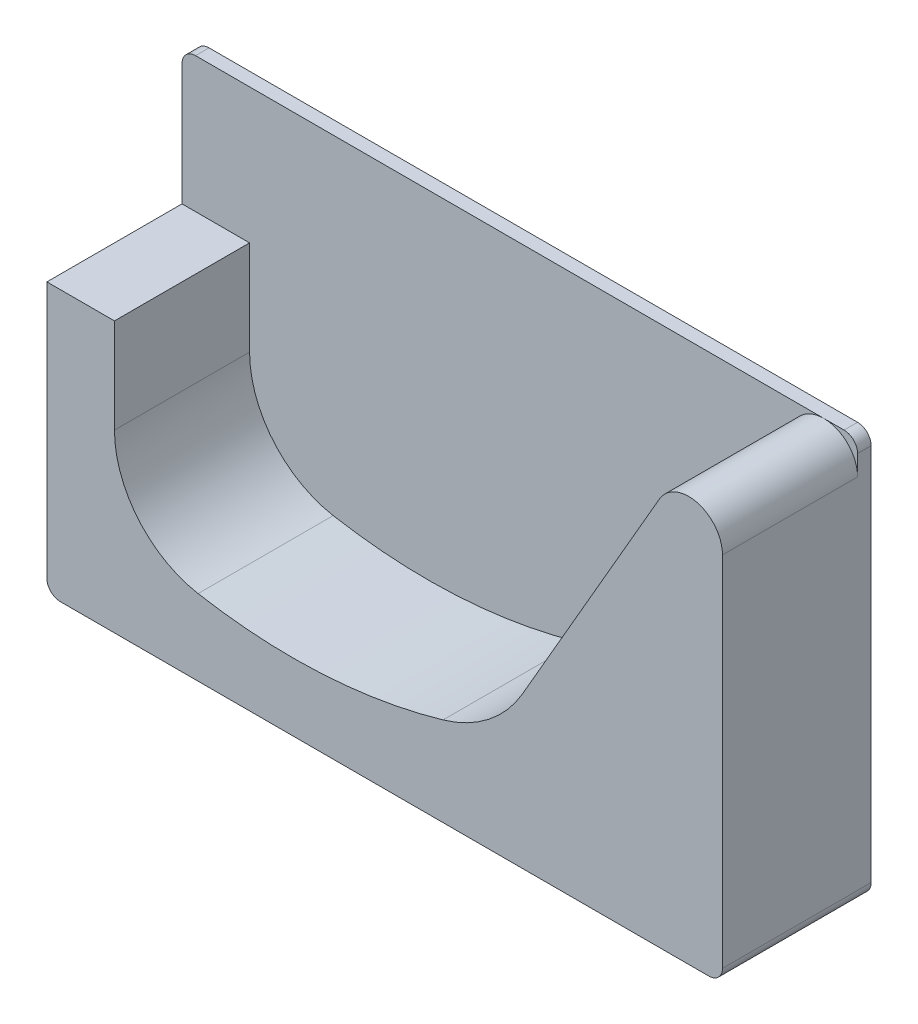
ISO-10303-21;
HEADER;
FILE_DESCRIPTION(('STEP AP214'),'2;1');
FILE_NAME('part.step','',(''),(''),'','','');
FILE_SCHEMA(('AUTOMOTIVE_DESIGN { 1 0 10303 214 1 1 1 1 }'));
ENDSEC;
DATA;
#1=APPLICATION_CONTEXT('core data for automotive mechanical design processes');
#2=APPLICATION_PROTOCOL_DEFINITION('international standard','automotive_design',2000,#1);
#3=PRODUCT_CONTEXT('',#1,'mechanical');
#4=PRODUCT('Part','Part','',(#3));
#5=PRODUCT_RELATED_PRODUCT_CATEGORY('part','',(#4));
#6=PRODUCT_DEFINITION_FORMATION('','',#4);
#7=PRODUCT_DEFINITION_CONTEXT('part definition',#1,'design');
#8=PRODUCT_DEFINITION('design','',#6,#7);
#9=PRODUCT_DEFINITION_SHAPE('','',#8);
#10=(LENGTH_UNIT() NAMED_UNIT(*) SI_UNIT(.MILLI.,.METRE.));
#11=(NAMED_UNIT(*) PLANE_ANGLE_UNIT() SI_UNIT($,.RADIAN.));
#12=(NAMED_UNIT(*) SI_UNIT($,.STERADIAN.) SOLID_ANGLE_UNIT());
#13=UNCERTAINTY_MEASURE_WITH_UNIT(LENGTH_MEASURE(1.E-05),#10,'distance_accuracy_value','');
#14=(GEOMETRIC_REPRESENTATION_CONTEXT(3) GLOBAL_UNCERTAINTY_ASSIGNED_CONTEXT((#13)) GLOBAL_UNIT_ASSIGNED_CONTEXT((#10,
#11,#12)) REPRESENTATION_CONTEXT('',''));
#15=CARTESIAN_POINT('',(0.,0.,0.));
#16=DIRECTION('',(0.,0.,1.));
#17=DIRECTION('',(1.,0.,0.));
#18=AXIS2_PLACEMENT_3D('',#15,#16,#17);
#19=CARTESIAN_POINT('',(0.,0.,2.));
#20=DIRECTION('',(0.,0.,-1.));
#21=DIRECTION('',(-1.,0.,0.));
#22=AXIS2_PLACEMENT_3D('',#19,#20,#21);
#23=PLANE('',#22);
#24=CARTESIAN_POINT('',(95.,55.,2.));
#25=DIRECTION('',(0.,0.,1.));
#26=DIRECTION('',(-1.,0.,0.));
#27=AXIS2_PLACEMENT_3D('',#24,#25,#26);
#28=CIRCLE('',#27,5.);
#29=CARTESIAN_POINT('',(100.,55.,2.));
#30=VERTEX_POINT('',#29);
#31=CARTESIAN_POINT('',(95.,60.,2.));
#32=VERTEX_POINT('',#31);
#33=EDGE_CURVE('E57',#30,#32,#28,.T.);
#34=ORIENTED_EDGE('',*,*,#33,.F.);
#35=DIRECTION('',(0.,1.,0.));
#36=VECTOR('',#35,1.);
#37=CARTESIAN_POINT('',(100.,0.,2.));
#38=LINE('',#37,#36);
#39=CARTESIAN_POINT('',(100.,58.,2.));
#40=VERTEX_POINT('',#39);
#41=EDGE_CURVE('E201',#30,#40,#38,.T.);
#42=ORIENTED_EDGE('',*,*,#41,.T.);
#43=CARTESIAN_POINT('',(98.,58.,2.));
#44=DIRECTION('',(0.,0.,-1.));
#45=DIRECTION('',(-1.,0.,0.));
#46=AXIS2_PLACEMENT_3D('',#43,#44,#45);
#47=CIRCLE('',#46,2.);
#48=CARTESIAN_POINT('',(98.,60.,2.));
#49=VERTEX_POINT('',#48);
#50=EDGE_CURVE('E253',#40,#49,#47,.F.);
#51=ORIENTED_EDGE('',*,*,#50,.T.);
#52=DIRECTION('',(-1.,0.,0.));
#53=VECTOR('',#52,1.);
#54=CARTESIAN_POINT('',(0.,60.,2.));
#55=LINE('',#54,#53);
#56=EDGE_CURVE('E208',#49,#32,#55,.T.);
#57=ORIENTED_EDGE('',*,*,#56,.T.);
#58=EDGE_LOOP('',(#34,#42,#51,#57));
#59=FACE_BOUND('',#58,.T.);
#60=ADVANCED_FACE('F44',(#59),#23,.F.);
#61=CARTESIAN_POINT('',(90.6698729810778,57.5,2.));
#62=VERTEX_POINT('',#61);
#63=EDGE_CURVE('E11',#32,#62,#28,.T.);
#64=ORIENTED_EDGE('',*,*,#63,.F.);
#65=CARTESIAN_POINT('',(2.,60.,2.));
#66=VERTEX_POINT('',#65);
#67=EDGE_CURVE('E210',#32,#66,#55,.T.);
#68=ORIENTED_EDGE('',*,*,#67,.T.);
#69=CARTESIAN_POINT('',(2.,58.,2.));
#70=DIRECTION('',(0.,0.,-1.));
#71=DIRECTION('',(-1.,0.,0.));
#72=AXIS2_PLACEMENT_3D('',#69,#70,#71);
#73=CIRCLE('',#72,2.);
#74=CARTESIAN_POINT('',(0.,58.,2.));
#75=VERTEX_POINT('',#74);
#76=EDGE_CURVE('E248',#66,#75,#73,.F.);
#77=ORIENTED_EDGE('',*,*,#76,.T.);
#78=DIRECTION('',(0.,-1.,0.));
#79=VECTOR('',#78,1.);
#80=CARTESIAN_POINT('',(0.,0.,2.));
#81=LINE('',#80,#79);
#82=CARTESIAN_POINT('',(0.,40.,2.));
#83=VERTEX_POINT('',#82);
#84=EDGE_CURVE('E199',#75,#83,#81,.T.);
#85=ORIENTED_EDGE('',*,*,#84,.T.);
#86=DIRECTION('',(-1.,0.,0.));
#87=VECTOR('',#86,1.);
#88=CARTESIAN_POINT('',(0.,40.,2.));
#89=LINE('',#88,#87);
#90=CARTESIAN_POINT('',(10.,40.,2.));
#91=VERTEX_POINT('',#90);
#92=EDGE_CURVE('E295',#91,#83,#89,.T.);
#93=ORIENTED_EDGE('',*,*,#92,.F.);
#94=DIRECTION('',(0.,1.,0.));
#95=VECTOR('',#94,1.);
#96=CARTESIAN_POINT('',(10.,40.,2.));
#97=LINE('',#96,#95);
#98=CARTESIAN_POINT('',(10.,26.,2.));
#99=VERTEX_POINT('',#98);
#100=EDGE_CURVE('E299',#99,#91,#97,.T.);
#101=ORIENTED_EDGE('',*,*,#100,.F.);
#102=CARTESIAN_POINT('',(25.,26.,2.));
#103=DIRECTION('',(0.,0.,-1.));
#104=DIRECTION('',(1.,0.,0.));
#105=AXIS2_PLACEMENT_3D('',#102,#103,#104);
#106=CIRCLE('',#105,15.);
#107=CARTESIAN_POINT('',(22.3789653788614,11.2307692307692,2.));
#108=VERTEX_POINT('',#107);
#109=EDGE_CURVE('E186',#108,#99,#106,.T.);
#110=ORIENTED_EDGE('',*,*,#109,.F.);
#111=CARTESIAN_POINT('',(36.3578166916006,90.,2.));
#112=DIRECTION('',(0.,0.,-1.));
#113=DIRECTION('',(1.,0.,0.));
#114=AXIS2_PLACEMENT_3D('',#111,#112,#113);
#115=CIRCLE('',#114,80.);
#116=CARTESIAN_POINT('',(58.6401265520551,13.1657715124132,2.));
#117=VERTEX_POINT('',#116);
#118=EDGE_CURVE('E184',#117,#108,#115,.T.);
#119=ORIENTED_EDGE('',*,*,#118,.F.);
#120=CARTESIAN_POINT('',(53.0695490869415,32.3743286343099,2.));
#121=DIRECTION('',(0.,0.,-1.));
#122=DIRECTION('',(1.,0.,0.));
#123=AXIS2_PLACEMENT_3D('',#120,#121,#122);
#124=CIRCLE('',#123,20.);
#125=CARTESIAN_POINT('',(70.3900571626302,22.3743286343099,2.));
#126=VERTEX_POINT('',#125);
#127=EDGE_CURVE('E70',#126,#117,#124,.T.);
#128=ORIENTED_EDGE('',*,*,#127,.F.);
#129=DIRECTION('',(-0.500000000000001,-0.866025403784438,0.));
#130=VECTOR('',#129,1.);
#131=CARTESIAN_POINT('',(70.3900571626302,22.3743286343099,2.));
#132=LINE('',#131,#130);
#133=EDGE_CURVE('E65',#62,#126,#132,.T.);
#134=ORIENTED_EDGE('',*,*,#133,.F.);
#135=EDGE_LOOP('',(#64,#68,#77,#85,#93,#101,#110,#119,#128,#134));
#136=FACE_BOUND('',#135,.T.);
#137=ADVANCED_FACE('F292',(#136),#23,.F.);
#138=CARTESIAN_POINT('',(0.,0.,2.));
#139=DIRECTION('',(1.,0.,0.));
#140=DIRECTION('',(0.,0.,-1.));
#141=AXIS2_PLACEMENT_3D('',#138,#139,#140);
#142=PLANE('',#141);
#143=DIRECTION('',(0.,-1.,0.));
#144=VECTOR('',#143,1.);
#145=CARTESIAN_POINT('',(0.,0.,0.));
#146=LINE('',#145,#144);
#147=CARTESIAN_POINT('',(0.,58.,0.));
#148=VERTEX_POINT('',#147);
#149=CARTESIAN_POINT('',(0.,2.,0.));
#150=VERTEX_POINT('',#149);
#151=EDGE_CURVE('E188',#148,#150,#146,.T.);
#152=ORIENTED_EDGE('',*,*,#151,.T.);
#153=DIRECTION('',(0.,0.,-1.));
#154=VECTOR('',#153,1.);
#155=CARTESIAN_POINT('',(0.,2.,2.));
#156=LINE('',#155,#154);
#157=CARTESIAN_POINT('',(0.,1.99999999999999,22.));
#158=VERTEX_POINT('',#157);
#159=EDGE_CURVE('E242',#150,#158,#156,.F.);
#160=ORIENTED_EDGE('',*,*,#159,.T.);
#161=DIRECTION('',(0.,-1.,0.));
#162=VECTOR('',#161,1.);
#163=CARTESIAN_POINT('',(0.,1.99999999999999,22.));
#164=LINE('',#163,#162);
#165=CARTESIAN_POINT('',(0.,40.,22.));
#166=VERTEX_POINT('',#165);
#167=EDGE_CURVE('E357',#166,#158,#164,.T.);
#168=ORIENTED_EDGE('',*,*,#167,.F.);
#169=DIRECTION('',(0.,0.,-1.));
#170=VECTOR('',#169,1.);
#171=CARTESIAN_POINT('',(0.,40.,22.));
#172=LINE('',#171,#170);
#173=EDGE_CURVE('E198',#166,#83,#172,.T.);
#174=ORIENTED_EDGE('',*,*,#173,.T.);
#175=ORIENTED_EDGE('',*,*,#84,.F.);
#176=DIRECTION('',(0.,0.,-1.));
#177=VECTOR('',#176,1.);
#178=CARTESIAN_POINT('',(0.,58.,2.));
#179=LINE('',#178,#177);
#180=EDGE_CURVE('E244',#75,#148,#179,.T.);
#181=ORIENTED_EDGE('',*,*,#180,.T.);
#182=EDGE_LOOP('',(#152,#160,#168,#174,#175,#181));
#183=FACE_BOUND('',#182,.T.);
#184=ADVANCED_FACE('F282',(#183),#142,.F.);
#185=CARTESIAN_POINT('',(0.,0.,2.));
#186=DIRECTION('',(0.,1.,0.));
#187=DIRECTION('',(0.,0.,1.));
#188=AXIS2_PLACEMENT_3D('',#185,#186,#187);
#189=PLANE('',#188);
#190=DIRECTION('',(0.,0.,-1.));
#191=VECTOR('',#190,1.);
#192=CARTESIAN_POINT('',(98.,0.,2.));
#193=LINE('',#192,#191);
#194=CARTESIAN_POINT('',(98.,0.,0.));
#195=VERTEX_POINT('',#194);
#196=CARTESIAN_POINT('',(98.,0.,22.));
#197=VERTEX_POINT('',#196);
#198=EDGE_CURVE('E211',#195,#197,#193,.F.);
#199=ORIENTED_EDGE('',*,*,#198,.T.);
#200=DIRECTION('',(1.,0.,0.));
#201=VECTOR('',#200,1.);
#202=CARTESIAN_POINT('',(98.,0.,22.));
#203=LINE('',#202,#201);
#204=CARTESIAN_POINT('',(2.,0.,22.));
#205=VERTEX_POINT('',#204);
#206=EDGE_CURVE('E346',#205,#197,#203,.T.);
#207=ORIENTED_EDGE('',*,*,#206,.F.);
#208=DIRECTION('',(0.,0.,-1.));
#209=VECTOR('',#208,1.);
#210=CARTESIAN_POINT('',(2.,0.,2.));
#211=LINE('',#210,#209);
#212=CARTESIAN_POINT('',(2.,0.,0.));
#213=VERTEX_POINT('',#212);
#214=EDGE_CURVE('E223',#205,#213,#211,.T.);
#215=ORIENTED_EDGE('',*,*,#214,.T.);
#216=DIRECTION('',(1.,0.,0.));
#217=VECTOR('',#216,1.);
#218=CARTESIAN_POINT('',(0.,0.,0.));
#219=LINE('',#218,#217);
#220=EDGE_CURVE('E194',#213,#195,#219,.T.);
#221=ORIENTED_EDGE('',*,*,#220,.T.);
#222=EDGE_LOOP('',(#199,#207,#215,#221));
#223=FACE_BOUND('',#222,.T.);
#224=ADVANCED_FACE('F366',(#223),#189,.F.);
#225=CARTESIAN_POINT('',(100.,0.,2.));
#226=DIRECTION('',(-1.,0.,0.));
#227=DIRECTION('',(0.,0.,1.));
#228=AXIS2_PLACEMENT_3D('',#225,#226,#227);
#229=PLANE('',#228);
#230=ORIENTED_EDGE('',*,*,#41,.F.);
#231=DIRECTION('',(0.,0.,-1.));
#232=VECTOR('',#231,1.);
#233=CARTESIAN_POINT('',(100.,55.,22.));
#234=LINE('',#233,#232);
#235=CARTESIAN_POINT('',(100.,55.,22.));
#236=VERTEX_POINT('',#235);
#237=EDGE_CURVE('E326',#236,#30,#234,.T.);
#238=ORIENTED_EDGE('',*,*,#237,.F.);
#239=DIRECTION('',(0.,1.,0.));
#240=VECTOR('',#239,1.);
#241=CARTESIAN_POINT('',(100.,55.,22.));
#242=LINE('',#241,#240);
#243=CARTESIAN_POINT('',(100.,2.,22.));
#244=VERTEX_POINT('',#243);
#245=EDGE_CURVE('E342',#244,#236,#242,.T.);
#246=ORIENTED_EDGE('',*,*,#245,.F.);
#247=DIRECTION('',(0.,0.,-1.));
#248=VECTOR('',#247,1.);
#249=CARTESIAN_POINT('',(100.,2.,2.));
#250=LINE('',#249,#248);
#251=CARTESIAN_POINT('',(100.,2.,0.));
#252=VERTEX_POINT('',#251);
#253=EDGE_CURVE('E256',#244,#252,#250,.T.);
#254=ORIENTED_EDGE('',*,*,#253,.T.);
#255=DIRECTION('',(0.,1.,0.));
#256=VECTOR('',#255,1.);
#257=CARTESIAN_POINT('',(100.,0.,0.));
#258=LINE('',#257,#256);
#259=CARTESIAN_POINT('',(100.,58.,0.));
#260=VERTEX_POINT('',#259);
#261=EDGE_CURVE('E216',#252,#260,#258,.T.);
#262=ORIENTED_EDGE('',*,*,#261,.T.);
#263=DIRECTION('',(0.,0.,-1.));
#264=VECTOR('',#263,1.);
#265=CARTESIAN_POINT('',(100.,58.,2.));
#266=LINE('',#265,#264);
#267=EDGE_CURVE('E255',#260,#40,#266,.F.);
#268=ORIENTED_EDGE('',*,*,#267,.T.);
#269=EDGE_LOOP('',(#230,#238,#246,#254,#262,#268));
#270=FACE_BOUND('',#269,.T.);
#271=ADVANCED_FACE('F376',(#270),#229,.F.);
#272=CARTESIAN_POINT('',(0.,60.,2.));
#273=DIRECTION('',(0.,-1.,0.));
#274=DIRECTION('',(0.,0.,-1.));
#275=AXIS2_PLACEMENT_3D('',#272,#273,#274);
#276=PLANE('',#275);
#277=ORIENTED_EDGE('',*,*,#56,.F.);
#278=DIRECTION('',(0.,0.,-1.));
#279=VECTOR('',#278,1.);
#280=CARTESIAN_POINT('',(98.,60.,2.));
#281=LINE('',#280,#279);
#282=CARTESIAN_POINT('',(98.,60.,0.));
#283=VERTEX_POINT('',#282);
#284=EDGE_CURVE('E47',#49,#283,#281,.T.);
#285=ORIENTED_EDGE('',*,*,#284,.T.);
#286=DIRECTION('',(-1.,0.,0.));
#287=VECTOR('',#286,1.);
#288=CARTESIAN_POINT('',(0.,60.,0.));
#289=LINE('',#288,#287);
#290=CARTESIAN_POINT('',(2.,60.,0.));
#291=VERTEX_POINT('',#290);
#292=EDGE_CURVE('E204',#283,#291,#289,.T.);
#293=ORIENTED_EDGE('',*,*,#292,.T.);
#294=DIRECTION('',(0.,0.,-1.));
#295=VECTOR('',#294,1.);
#296=CARTESIAN_POINT('',(2.,60.,2.));
#297=LINE('',#296,#295);
#298=EDGE_CURVE('E261',#291,#66,#297,.F.);
#299=ORIENTED_EDGE('',*,*,#298,.T.);
#300=ORIENTED_EDGE('',*,*,#67,.F.);
#301=EDGE_LOOP('',(#277,#285,#293,#299,#300));
#302=FACE_BOUND('',#301,.T.);
#303=ADVANCED_FACE('F272',(#302),#276,.F.);
#304=CARTESIAN_POINT('',(0.,0.,0.));
#305=DIRECTION('',(0.,0.,-1.));
#306=DIRECTION('',(-1.,0.,0.));
#307=AXIS2_PLACEMENT_3D('',#304,#305,#306);
#308=PLANE('',#307);
#309=ORIENTED_EDGE('',*,*,#220,.F.);
#310=CARTESIAN_POINT('',(2.,2.,0.));
#311=DIRECTION('',(0.,0.,-1.));
#312=DIRECTION('',(-1.,0.,0.));
#313=AXIS2_PLACEMENT_3D('',#310,#311,#312);
#314=CIRCLE('',#313,2.);
#315=EDGE_CURVE('E236',#213,#150,#314,.T.);
#316=ORIENTED_EDGE('',*,*,#315,.T.);
#317=ORIENTED_EDGE('',*,*,#151,.F.);
#318=CARTESIAN_POINT('',(2.,58.,0.));
#319=DIRECTION('',(0.,0.,-1.));
#320=DIRECTION('',(-1.,0.,0.));
#321=AXIS2_PLACEMENT_3D('',#318,#319,#320);
#322=CIRCLE('',#321,2.);
#323=EDGE_CURVE('E228',#148,#291,#322,.T.);
#324=ORIENTED_EDGE('',*,*,#323,.T.);
#325=ORIENTED_EDGE('',*,*,#292,.F.);
#326=CARTESIAN_POINT('',(98.,58.,0.));
#327=DIRECTION('',(0.,0.,-1.));
#328=DIRECTION('',(-1.,0.,0.));
#329=AXIS2_PLACEMENT_3D('',#326,#327,#328);
#330=CIRCLE('',#329,2.);
#331=EDGE_CURVE('E235',#283,#260,#330,.T.);
#332=ORIENTED_EDGE('',*,*,#331,.T.);
#333=ORIENTED_EDGE('',*,*,#261,.F.);
#334=CARTESIAN_POINT('',(98.,2.,0.));
#335=DIRECTION('',(0.,0.,-1.));
#336=DIRECTION('',(-1.,0.,0.));
#337=AXIS2_PLACEMENT_3D('',#334,#335,#336);
#338=CIRCLE('',#337,2.);
#339=EDGE_CURVE('E231',#252,#195,#338,.T.);
#340=ORIENTED_EDGE('',*,*,#339,.T.);
#341=EDGE_LOOP('',(#309,#316,#317,#324,#325,#332,#333,#340));
#342=FACE_BOUND('',#341,.T.);
#343=ADVANCED_FACE('F279',(#342),#308,.T.);
#344=CARTESIAN_POINT('',(2.,2.,2.));
#345=DIRECTION('',(0.,0.,-1.));
#346=DIRECTION('',(-1.,0.,0.));
#347=AXIS2_PLACEMENT_3D('',#344,#345,#346);
#348=CYLINDRICAL_SURFACE('',#347,2.);
#349=ORIENTED_EDGE('',*,*,#214,.F.);
#350=CARTESIAN_POINT('',(2.,2.,22.));
#351=DIRECTION('',(0.,0.,1.));
#352=DIRECTION('',(-1.,0.,0.));
#353=AXIS2_PLACEMENT_3D('',#350,#351,#352);
#354=CIRCLE('',#353,2.);
#355=EDGE_CURVE('E351',#158,#205,#354,.T.);
#356=ORIENTED_EDGE('',*,*,#355,.F.);
#357=ORIENTED_EDGE('',*,*,#159,.F.);
#358=ORIENTED_EDGE('',*,*,#315,.F.);
#359=EDGE_LOOP('',(#349,#356,#357,#358));
#360=FACE_BOUND('',#359,.T.);
#361=ADVANCED_FACE('F368',(#360),#348,.T.);
#362=CARTESIAN_POINT('',(98.,2.,2.));
#363=DIRECTION('',(0.,0.,-1.));
#364=DIRECTION('',(-1.,0.,0.));
#365=AXIS2_PLACEMENT_3D('',#362,#363,#364);
#366=CYLINDRICAL_SURFACE('',#365,2.);
#367=ORIENTED_EDGE('',*,*,#253,.F.);
#368=CARTESIAN_POINT('',(98.,2.,22.));
#369=DIRECTION('',(0.,0.,1.));
#370=DIRECTION('',(-1.,0.,0.));
#371=AXIS2_PLACEMENT_3D('',#368,#369,#370);
#372=CIRCLE('',#371,2.);
#373=EDGE_CURVE('E344',#197,#244,#372,.T.);
#374=ORIENTED_EDGE('',*,*,#373,.F.);
#375=ORIENTED_EDGE('',*,*,#198,.F.);
#376=ORIENTED_EDGE('',*,*,#339,.F.);
#377=EDGE_LOOP('',(#367,#374,#375,#376));
#378=FACE_BOUND('',#377,.T.);
#379=ADVANCED_FACE('F371',(#378),#366,.T.);
#380=CARTESIAN_POINT('',(98.,58.,2.));
#381=DIRECTION('',(0.,0.,-1.));
#382=DIRECTION('',(-1.,0.,0.));
#383=AXIS2_PLACEMENT_3D('',#380,#381,#382);
#384=CYLINDRICAL_SURFACE('',#383,2.);
#385=ORIENTED_EDGE('',*,*,#50,.F.);
#386=ORIENTED_EDGE('',*,*,#267,.F.);
#387=ORIENTED_EDGE('',*,*,#331,.F.);
#388=ORIENTED_EDGE('',*,*,#284,.F.);
#389=EDGE_LOOP('',(#385,#386,#387,#388));
#390=FACE_BOUND('',#389,.T.);
#391=ADVANCED_FACE('F424',(#390),#384,.T.);
#392=CARTESIAN_POINT('',(2.,58.,2.));
#393=DIRECTION('',(0.,0.,-1.));
#394=DIRECTION('',(-1.,0.,0.));
#395=AXIS2_PLACEMENT_3D('',#392,#393,#394);
#396=CYLINDRICAL_SURFACE('',#395,2.);
#397=ORIENTED_EDGE('',*,*,#76,.F.);
#398=ORIENTED_EDGE('',*,*,#298,.F.);
#399=ORIENTED_EDGE('',*,*,#323,.F.);
#400=ORIENTED_EDGE('',*,*,#180,.F.);
#401=EDGE_LOOP('',(#397,#398,#399,#400));
#402=FACE_BOUND('',#401,.T.);
#403=ADVANCED_FACE('F50',(#402),#396,.T.);
#404=CARTESIAN_POINT('',(25.,26.,22.));
#405=DIRECTION('',(0.,0.,-1.));
#406=DIRECTION('',(-1.,0.,0.));
#407=AXIS2_PLACEMENT_3D('',#404,#405,#406);
#408=CYLINDRICAL_SURFACE('',#407,15.);
#409=ORIENTED_EDGE('',*,*,#109,.T.);
#410=DIRECTION('',(0.,0.,-1.));
#411=VECTOR('',#410,1.);
#412=CARTESIAN_POINT('',(10.,26.,22.));
#413=LINE('',#412,#411);
#414=CARTESIAN_POINT('',(10.,26.,22.));
#415=VERTEX_POINT('',#414);
#416=EDGE_CURVE('E167',#415,#99,#413,.T.);
#417=ORIENTED_EDGE('',*,*,#416,.F.);
#418=CARTESIAN_POINT('',(25.,26.,22.));
#419=DIRECTION('',(0.,0.,-1.));
#420=DIRECTION('',(1.,0.,0.));
#421=AXIS2_PLACEMENT_3D('',#418,#419,#420);
#422=CIRCLE('',#421,15.);
#423=CARTESIAN_POINT('',(22.3789653788614,11.2307692307692,22.));
#424=VERTEX_POINT('',#423);
#425=EDGE_CURVE('E173',#424,#415,#422,.T.);
#426=ORIENTED_EDGE('',*,*,#425,.F.);
#427=DIRECTION('',(0.,0.,-1.));
#428=VECTOR('',#427,1.);
#429=CARTESIAN_POINT('',(22.3789653788614,11.2307692307692,22.));
#430=LINE('',#429,#428);
#431=EDGE_CURVE('E313',#424,#108,#430,.T.);
#432=ORIENTED_EDGE('',*,*,#431,.T.);
#433=EDGE_LOOP('',(#409,#417,#426,#432));
#434=FACE_BOUND('',#433,.T.);
#435=ADVANCED_FACE('F189',(#434),#408,.F.);
#436=CARTESIAN_POINT('',(10.,40.,22.));
#437=DIRECTION('',(-1.,0.,0.));
#438=DIRECTION('',(0.,-1.,0.));
#439=AXIS2_PLACEMENT_3D('',#436,#437,#438);
#440=PLANE('',#439);
#441=ORIENTED_EDGE('',*,*,#100,.T.);
#442=DIRECTION('',(0.,0.,-1.));
#443=VECTOR('',#442,1.);
#444=CARTESIAN_POINT('',(10.,40.,22.));
#445=LINE('',#444,#443);
#446=CARTESIAN_POINT('',(10.,40.,22.));
#447=VERTEX_POINT('',#446);
#448=EDGE_CURVE('E166',#447,#91,#445,.T.);
#449=ORIENTED_EDGE('',*,*,#448,.F.);
#450=DIRECTION('',(0.,1.,0.));
#451=VECTOR('',#450,1.);
#452=CARTESIAN_POINT('',(10.,40.,22.));
#453=LINE('',#452,#451);
#454=EDGE_CURVE('E161',#415,#447,#453,.T.);
#455=ORIENTED_EDGE('',*,*,#454,.F.);
#456=ORIENTED_EDGE('',*,*,#416,.T.);
#457=EDGE_LOOP('',(#441,#449,#455,#456));
#458=FACE_BOUND('',#457,.T.);
#459=ADVANCED_FACE('F163',(#458),#440,.F.);
#460=CARTESIAN_POINT('',(0.,40.,22.));
#461=DIRECTION('',(0.,-1.,0.));
#462=DIRECTION('',(0.,0.,-1.));
#463=AXIS2_PLACEMENT_3D('',#460,#461,#462);
#464=PLANE('',#463);
#465=ORIENTED_EDGE('',*,*,#92,.T.);
#466=ORIENTED_EDGE('',*,*,#173,.F.);
#467=DIRECTION('',(-1.,0.,0.));
#468=VECTOR('',#467,1.);
#469=CARTESIAN_POINT('',(0.,40.,22.));
#470=LINE('',#469,#468);
#471=EDGE_CURVE('E175',#447,#166,#470,.T.);
#472=ORIENTED_EDGE('',*,*,#471,.F.);
#473=ORIENTED_EDGE('',*,*,#448,.T.);
#474=EDGE_LOOP('',(#465,#466,#472,#473));
#475=FACE_BOUND('',#474,.T.);
#476=ADVANCED_FACE('F294',(#475),#464,.F.);
#477=CARTESIAN_POINT('',(95.,55.,22.));
#478=DIRECTION('',(0.,0.,-1.));
#479=DIRECTION('',(-1.,0.,0.));
#480=AXIS2_PLACEMENT_3D('',#477,#478,#479);
#481=CYLINDRICAL_SURFACE('',#480,5.);
#482=ORIENTED_EDGE('',*,*,#33,.T.);
#483=ORIENTED_EDGE('',*,*,#63,.T.);
#484=DIRECTION('',(0.,0.,-1.));
#485=VECTOR('',#484,1.);
#486=CARTESIAN_POINT('',(90.6698729810778,57.5,22.));
#487=LINE('',#486,#485);
#488=CARTESIAN_POINT('',(90.6698729810778,57.5,22.));
#489=VERTEX_POINT('',#488);
#490=EDGE_CURVE('E325',#489,#62,#487,.T.);
#491=ORIENTED_EDGE('',*,*,#490,.F.);
#492=CARTESIAN_POINT('',(95.,55.,22.));
#493=DIRECTION('',(0.,0.,1.));
#494=DIRECTION('',(-1.,0.,0.));
#495=AXIS2_PLACEMENT_3D('',#492,#493,#494);
#496=CIRCLE('',#495,5.);
#497=EDGE_CURVE('E340',#236,#489,#496,.T.);
#498=ORIENTED_EDGE('',*,*,#497,.F.);
#499=ORIENTED_EDGE('',*,*,#237,.T.);
#500=EDGE_LOOP('',(#482,#483,#491,#498,#499));
#501=FACE_BOUND('',#500,.T.);
#502=ADVANCED_FACE('F383',(#501),#481,.T.);
#503=CARTESIAN_POINT('',(70.3900571626302,22.3743286343099,22.));
#504=DIRECTION('',(0.866025403784438,-0.500000000000001,0.));
#505=DIRECTION('',(0.500000000000001,0.866025403784438,0.));
#506=AXIS2_PLACEMENT_3D('',#503,#504,#505);
#507=PLANE('',#506);
#508=ORIENTED_EDGE('',*,*,#133,.T.);
#509=DIRECTION('',(0.,0.,-1.));
#510=VECTOR('',#509,1.);
#511=CARTESIAN_POINT('',(70.3900571626302,22.3743286343099,22.));
#512=LINE('',#511,#510);
#513=CARTESIAN_POINT('',(70.3900571626302,22.3743286343099,22.));
#514=VERTEX_POINT('',#513);
#515=EDGE_CURVE('E318',#514,#126,#512,.T.);
#516=ORIENTED_EDGE('',*,*,#515,.F.);
#517=DIRECTION('',(-0.500000000000001,-0.866025403784438,0.));
#518=VECTOR('',#517,1.);
#519=CARTESIAN_POINT('',(70.3900571626302,22.3743286343099,22.));
#520=LINE('',#519,#518);
#521=EDGE_CURVE('E333',#489,#514,#520,.T.);
#522=ORIENTED_EDGE('',*,*,#521,.F.);
#523=ORIENTED_EDGE('',*,*,#490,.T.);
#524=EDGE_LOOP('',(#508,#516,#522,#523));
#525=FACE_BOUND('',#524,.T.);
#526=ADVANCED_FACE('F387',(#525),#507,.F.);
#527=CARTESIAN_POINT('',(53.0695490869415,32.3743286343099,22.));
#528=DIRECTION('',(0.,0.,-1.));
#529=DIRECTION('',(-1.,0.,0.));
#530=AXIS2_PLACEMENT_3D('',#527,#528,#529);
#531=CYLINDRICAL_SURFACE('',#530,20.);
#532=ORIENTED_EDGE('',*,*,#127,.T.);
#533=DIRECTION('',(0.,0.,-1.));
#534=VECTOR('',#533,1.);
#535=CARTESIAN_POINT('',(58.6401265520551,13.1657715124132,22.));
#536=LINE('',#535,#534);
#537=CARTESIAN_POINT('',(58.6401265520551,13.1657715124132,22.));
#538=VERTEX_POINT('',#537);
#539=EDGE_CURVE('E314',#538,#117,#536,.T.);
#540=ORIENTED_EDGE('',*,*,#539,.F.);
#541=CARTESIAN_POINT('',(53.0695490869415,32.3743286343099,22.));
#542=DIRECTION('',(0.,0.,-1.));
#543=DIRECTION('',(1.,0.,0.));
#544=AXIS2_PLACEMENT_3D('',#541,#542,#543);
#545=CIRCLE('',#544,20.);
#546=EDGE_CURVE('E335',#514,#538,#545,.T.);
#547=ORIENTED_EDGE('',*,*,#546,.F.);
#548=ORIENTED_EDGE('',*,*,#515,.T.);
#549=EDGE_LOOP('',(#532,#540,#547,#548));
#550=FACE_BOUND('',#549,.T.);
#551=ADVANCED_FACE('F388',(#550),#531,.F.);
#552=CARTESIAN_POINT('',(36.3578166916006,90.,22.));
#553=DIRECTION('',(0.,0.,-1.));
#554=DIRECTION('',(-1.,0.,0.));
#555=AXIS2_PLACEMENT_3D('',#552,#553,#554);
#556=CYLINDRICAL_SURFACE('',#555,80.);
#557=ORIENTED_EDGE('',*,*,#118,.T.);
#558=ORIENTED_EDGE('',*,*,#431,.F.);
#559=CARTESIAN_POINT('',(36.3578166916006,90.,22.));
#560=DIRECTION('',(0.,0.,-1.));
#561=DIRECTION('',(1.,0.,0.));
#562=AXIS2_PLACEMENT_3D('',#559,#560,#561);
#563=CIRCLE('',#562,80.);
#564=EDGE_CURVE('E179',#538,#424,#563,.T.);
#565=ORIENTED_EDGE('',*,*,#564,.F.);
#566=ORIENTED_EDGE('',*,*,#539,.T.);
#567=EDGE_LOOP('',(#557,#558,#565,#566));
#568=FACE_BOUND('',#567,.T.);
#569=ADVANCED_FACE('F391',(#568),#556,.F.);
#570=CARTESIAN_POINT('',(25.,26.,22.));
#571=DIRECTION('',(0.,0.,1.));
#572=DIRECTION('',(1.,0.,0.));
#573=AXIS2_PLACEMENT_3D('',#570,#571,#572);
#574=PLANE('',#573);
#575=ORIENTED_EDGE('',*,*,#425,.T.);
#576=ORIENTED_EDGE('',*,*,#454,.T.);
#577=ORIENTED_EDGE('',*,*,#471,.T.);
#578=ORIENTED_EDGE('',*,*,#167,.T.);
#579=ORIENTED_EDGE('',*,*,#355,.T.);
#580=ORIENTED_EDGE('',*,*,#206,.T.);
#581=ORIENTED_EDGE('',*,*,#373,.T.);
#582=ORIENTED_EDGE('',*,*,#245,.T.);
#583=ORIENTED_EDGE('',*,*,#497,.T.);
#584=ORIENTED_EDGE('',*,*,#521,.T.);
#585=ORIENTED_EDGE('',*,*,#546,.T.);
#586=ORIENTED_EDGE('',*,*,#564,.T.);
#587=EDGE_LOOP('',(#575,#576,#577,#578,#579,#580,#581,#582,#583,#584,#585,#586));
#588=FACE_BOUND('',#587,.T.);
#589=ADVANCED_FACE('F180',(#588),#574,.T.);
#590=CLOSED_SHELL('',(#60,#137,#184,#224,#271,#303,#343,#361,#379,#391,#403,#435,#459,#476,#502,
#526,#551,#569,#589));
#591=MANIFOLD_SOLID_BREP('B2',#590);
#592=ADVANCED_BREP_SHAPE_REPRESENTATION('',(#18,#591),#14);
#593=SHAPE_DEFINITION_REPRESENTATION(#9,#592);
ENDSEC;
END-ISO-10303-21;
